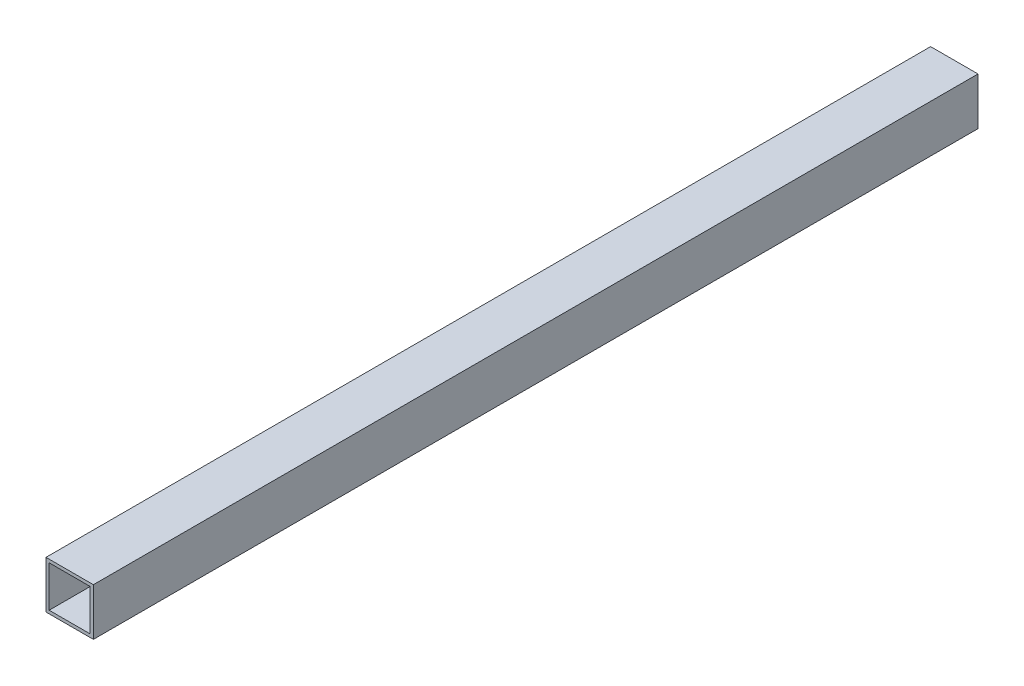
ISO-10303-21;
HEADER;
FILE_DESCRIPTION(('STEP AP214'),'2;1');
FILE_NAME('part.step','',(''),(''),'','','');
FILE_SCHEMA(('AUTOMOTIVE_DESIGN { 1 0 10303 214 1 1 1 1 }'));
ENDSEC;
DATA;
#1=APPLICATION_CONTEXT('core data for automotive mechanical design processes');
#2=APPLICATION_PROTOCOL_DEFINITION('international standard','automotive_design',2000,#1);
#3=PRODUCT_CONTEXT('',#1,'mechanical');
#4=PRODUCT('Part','Part','',(#3));
#5=PRODUCT_RELATED_PRODUCT_CATEGORY('part','',(#4));
#6=PRODUCT_DEFINITION_FORMATION('','',#4);
#7=PRODUCT_DEFINITION_CONTEXT('part definition',#1,'design');
#8=PRODUCT_DEFINITION('design','',#6,#7);
#9=PRODUCT_DEFINITION_SHAPE('','',#8);
#10=(LENGTH_UNIT() NAMED_UNIT(*) SI_UNIT(.MILLI.,.METRE.));
#11=(NAMED_UNIT(*) PLANE_ANGLE_UNIT() SI_UNIT($,.RADIAN.));
#12=(NAMED_UNIT(*) SI_UNIT($,.STERADIAN.) SOLID_ANGLE_UNIT());
#13=UNCERTAINTY_MEASURE_WITH_UNIT(LENGTH_MEASURE(1.E-05),#10,'distance_accuracy_value','');
#14=(GEOMETRIC_REPRESENTATION_CONTEXT(3) GLOBAL_UNCERTAINTY_ASSIGNED_CONTEXT((#13)) GLOBAL_UNIT_ASSIGNED_CONTEXT((#10,
#11,#12)) REPRESENTATION_CONTEXT('',''));
#15=CARTESIAN_POINT('',(0.,0.,0.));
#16=DIRECTION('',(0.,0.,1.));
#17=DIRECTION('',(1.,0.,0.));
#18=AXIS2_PLACEMENT_3D('',#15,#16,#17);
#19=CARTESIAN_POINT('',(0.,0.,280.));
#20=DIRECTION('',(0.,0.,1.));
#21=DIRECTION('',(1.,0.,0.));
#22=AXIS2_PLACEMENT_3D('',#19,#20,#21);
#23=PLANE('',#22);
#24=DIRECTION('',(0.,-1.,0.));
#25=VECTOR('',#24,1.);
#26=CARTESIAN_POINT('',(-7.5,7.5,280.));
#27=LINE('',#26,#25);
#28=CARTESIAN_POINT('',(-7.5,7.5,280.));
#29=VERTEX_POINT('',#28);
#30=CARTESIAN_POINT('',(-7.5,-7.5,280.));
#31=VERTEX_POINT('',#30);
#32=EDGE_CURVE('E133',#29,#31,#27,.T.);
#33=ORIENTED_EDGE('',*,*,#32,.T.);
#34=DIRECTION('',(1.,0.,0.));
#35=VECTOR('',#34,1.);
#36=CARTESIAN_POINT('',(-7.5,-7.5,280.));
#37=LINE('',#36,#35);
#38=CARTESIAN_POINT('',(7.5,-7.5,280.));
#39=VERTEX_POINT('',#38);
#40=EDGE_CURVE('E136',#31,#39,#37,.T.);
#41=ORIENTED_EDGE('',*,*,#40,.T.);
#42=DIRECTION('',(0.,1.,0.));
#43=VECTOR('',#42,1.);
#44=CARTESIAN_POINT('',(7.5,7.5,280.));
#45=LINE('',#44,#43);
#46=CARTESIAN_POINT('',(7.5,7.5,280.));
#47=VERTEX_POINT('',#46);
#48=EDGE_CURVE('E139',#39,#47,#45,.T.);
#49=ORIENTED_EDGE('',*,*,#48,.T.);
#50=DIRECTION('',(-1.,0.,0.));
#51=VECTOR('',#50,1.);
#52=CARTESIAN_POINT('',(-7.5,7.5,280.));
#53=LINE('',#52,#51);
#54=EDGE_CURVE('E141',#47,#29,#53,.T.);
#55=ORIENTED_EDGE('',*,*,#54,.T.);
#56=EDGE_LOOP('',(#33,#41,#49,#55));
#57=FACE_BOUND('',#56,.T.);
#58=DIRECTION('',(-1.,0.,0.));
#59=VECTOR('',#58,1.);
#60=CARTESIAN_POINT('',(-6.5,6.5,280.));
#61=LINE('',#60,#59);
#62=CARTESIAN_POINT('',(6.5,6.5,280.));
#63=VERTEX_POINT('',#62);
#64=CARTESIAN_POINT('',(-6.5,6.5,280.));
#65=VERTEX_POINT('',#64);
#66=EDGE_CURVE('E105',#63,#65,#61,.T.);
#67=ORIENTED_EDGE('',*,*,#66,.F.);
#68=DIRECTION('',(0.,1.,0.));
#69=VECTOR('',#68,1.);
#70=CARTESIAN_POINT('',(6.5,6.5,280.));
#71=LINE('',#70,#69);
#72=CARTESIAN_POINT('',(6.5,-6.5,280.));
#73=VERTEX_POINT('',#72);
#74=EDGE_CURVE('E97',#73,#63,#71,.T.);
#75=ORIENTED_EDGE('',*,*,#74,.F.);
#76=DIRECTION('',(1.,0.,0.));
#77=VECTOR('',#76,1.);
#78=CARTESIAN_POINT('',(-6.5,-6.5,280.));
#79=LINE('',#78,#77);
#80=CARTESIAN_POINT('',(-6.5,-6.5,280.));
#81=VERTEX_POINT('',#80);
#82=EDGE_CURVE('E119',#81,#73,#79,.T.);
#83=ORIENTED_EDGE('',*,*,#82,.F.);
#84=DIRECTION('',(0.,-1.,0.));
#85=VECTOR('',#84,1.);
#86=CARTESIAN_POINT('',(-6.5,6.5,280.));
#87=LINE('',#86,#85);
#88=EDGE_CURVE('E117',#65,#81,#87,.T.);
#89=ORIENTED_EDGE('',*,*,#88,.F.);
#90=EDGE_LOOP('',(#67,#75,#83,#89));
#91=FACE_BOUND('',#90,.T.);
#92=ADVANCED_FACE('F32',(#57,#91),#23,.T.);
#93=CARTESIAN_POINT('',(0.,0.,0.));
#94=DIRECTION('',(0.,0.,1.));
#95=DIRECTION('',(1.,0.,0.));
#96=AXIS2_PLACEMENT_3D('',#93,#94,#95);
#97=PLANE('',#96);
#98=DIRECTION('',(0.,-1.,0.));
#99=VECTOR('',#98,1.);
#100=CARTESIAN_POINT('',(-7.5,7.5,0.));
#101=LINE('',#100,#99);
#102=CARTESIAN_POINT('',(-7.5,7.5,0.));
#103=VERTEX_POINT('',#102);
#104=CARTESIAN_POINT('',(-7.5,-7.5,0.));
#105=VERTEX_POINT('',#104);
#106=EDGE_CURVE('E113',#103,#105,#101,.T.);
#107=ORIENTED_EDGE('',*,*,#106,.F.);
#108=DIRECTION('',(-1.,0.,0.));
#109=VECTOR('',#108,1.);
#110=CARTESIAN_POINT('',(-7.5,7.5,0.));
#111=LINE('',#110,#109);
#112=CARTESIAN_POINT('',(7.5,7.5,0.));
#113=VERTEX_POINT('',#112);
#114=EDGE_CURVE('E137',#113,#103,#111,.T.);
#115=ORIENTED_EDGE('',*,*,#114,.F.);
#116=DIRECTION('',(0.,1.,0.));
#117=VECTOR('',#116,1.);
#118=CARTESIAN_POINT('',(7.5,7.5,0.));
#119=LINE('',#118,#117);
#120=CARTESIAN_POINT('',(7.5,-7.5,0.));
#121=VERTEX_POINT('',#120);
#122=EDGE_CURVE('E148',#121,#113,#119,.T.);
#123=ORIENTED_EDGE('',*,*,#122,.F.);
#124=DIRECTION('',(1.,0.,0.));
#125=VECTOR('',#124,1.);
#126=CARTESIAN_POINT('',(-7.5,-7.5,0.));
#127=LINE('',#126,#125);
#128=EDGE_CURVE('E146',#105,#121,#127,.T.);
#129=ORIENTED_EDGE('',*,*,#128,.F.);
#130=EDGE_LOOP('',(#107,#115,#123,#129));
#131=FACE_BOUND('',#130,.T.);
#132=DIRECTION('',(0.,1.,0.));
#133=VECTOR('',#132,1.);
#134=CARTESIAN_POINT('',(6.5,6.5,0.));
#135=LINE('',#134,#133);
#136=CARTESIAN_POINT('',(6.5,-6.5,0.));
#137=VERTEX_POINT('',#136);
#138=CARTESIAN_POINT('',(6.5,6.5,0.));
#139=VERTEX_POINT('',#138);
#140=EDGE_CURVE('E55',#137,#139,#135,.T.);
#141=ORIENTED_EDGE('',*,*,#140,.T.);
#142=DIRECTION('',(-1.,0.,0.));
#143=VECTOR('',#142,1.);
#144=CARTESIAN_POINT('',(-6.5,6.5,0.));
#145=LINE('',#144,#143);
#146=CARTESIAN_POINT('',(-6.5,6.5,0.));
#147=VERTEX_POINT('',#146);
#148=EDGE_CURVE('E112',#139,#147,#145,.T.);
#149=ORIENTED_EDGE('',*,*,#148,.T.);
#150=DIRECTION('',(0.,-1.,0.));
#151=VECTOR('',#150,1.);
#152=CARTESIAN_POINT('',(-6.5,6.5,0.));
#153=LINE('',#152,#151);
#154=CARTESIAN_POINT('',(-6.5,-6.5,0.));
#155=VERTEX_POINT('',#154);
#156=EDGE_CURVE('E125',#147,#155,#153,.T.);
#157=ORIENTED_EDGE('',*,*,#156,.T.);
#158=DIRECTION('',(1.,0.,0.));
#159=VECTOR('',#158,1.);
#160=CARTESIAN_POINT('',(-6.5,-6.5,0.));
#161=LINE('',#160,#159);
#162=EDGE_CURVE('E106',#155,#137,#161,.T.);
#163=ORIENTED_EDGE('',*,*,#162,.T.);
#164=EDGE_LOOP('',(#141,#149,#157,#163));
#165=FACE_BOUND('',#164,.T.);
#166=ADVANCED_FACE('F166',(#131,#165),#97,.F.);
#167=CARTESIAN_POINT('',(-7.5,7.5,280.));
#168=DIRECTION('',(1.,0.,0.));
#169=DIRECTION('',(0.,1.,0.));
#170=AXIS2_PLACEMENT_3D('',#167,#168,#169);
#171=PLANE('',#170);
#172=ORIENTED_EDGE('',*,*,#106,.T.);
#173=DIRECTION('',(0.,0.,-1.));
#174=VECTOR('',#173,1.);
#175=CARTESIAN_POINT('',(-7.5,-7.5,280.));
#176=LINE('',#175,#174);
#177=EDGE_CURVE('E11',#31,#105,#176,.T.);
#178=ORIENTED_EDGE('',*,*,#177,.F.);
#179=ORIENTED_EDGE('',*,*,#32,.F.);
#180=DIRECTION('',(0.,0.,-1.));
#181=VECTOR('',#180,1.);
#182=CARTESIAN_POINT('',(-7.5,7.5,280.));
#183=LINE('',#182,#181);
#184=EDGE_CURVE('E143',#29,#103,#183,.T.);
#185=ORIENTED_EDGE('',*,*,#184,.T.);
#186=EDGE_LOOP('',(#172,#178,#179,#185));
#187=FACE_BOUND('',#186,.T.);
#188=ADVANCED_FACE('F34',(#187),#171,.F.);
#189=CARTESIAN_POINT('',(-7.5,-7.5,280.));
#190=DIRECTION('',(0.,1.,0.));
#191=DIRECTION('',(0.,0.,1.));
#192=AXIS2_PLACEMENT_3D('',#189,#190,#191);
#193=PLANE('',#192);
#194=ORIENTED_EDGE('',*,*,#128,.T.);
#195=DIRECTION('',(0.,0.,-1.));
#196=VECTOR('',#195,1.);
#197=CARTESIAN_POINT('',(7.5,-7.5,280.));
#198=LINE('',#197,#196);
#199=EDGE_CURVE('E40',#39,#121,#198,.T.);
#200=ORIENTED_EDGE('',*,*,#199,.F.);
#201=ORIENTED_EDGE('',*,*,#40,.F.);
#202=ORIENTED_EDGE('',*,*,#177,.T.);
#203=EDGE_LOOP('',(#194,#200,#201,#202));
#204=FACE_BOUND('',#203,.T.);
#205=ADVANCED_FACE('F176',(#204),#193,.F.);
#206=CARTESIAN_POINT('',(7.5,7.5,280.));
#207=DIRECTION('',(-1.,0.,0.));
#208=DIRECTION('',(0.,-1.,0.));
#209=AXIS2_PLACEMENT_3D('',#206,#207,#208);
#210=PLANE('',#209);
#211=ORIENTED_EDGE('',*,*,#122,.T.);
#212=DIRECTION('',(0.,0.,-1.));
#213=VECTOR('',#212,1.);
#214=CARTESIAN_POINT('',(7.5,7.5,280.));
#215=LINE('',#214,#213);
#216=EDGE_CURVE('E153',#47,#113,#215,.T.);
#217=ORIENTED_EDGE('',*,*,#216,.F.);
#218=ORIENTED_EDGE('',*,*,#48,.F.);
#219=ORIENTED_EDGE('',*,*,#199,.T.);
#220=EDGE_LOOP('',(#211,#217,#218,#219));
#221=FACE_BOUND('',#220,.T.);
#222=ADVANCED_FACE('F160',(#221),#210,.F.);
#223=CARTESIAN_POINT('',(-7.5,7.5,280.));
#224=DIRECTION('',(0.,-1.,0.));
#225=DIRECTION('',(0.,0.,-1.));
#226=AXIS2_PLACEMENT_3D('',#223,#224,#225);
#227=PLANE('',#226);
#228=ORIENTED_EDGE('',*,*,#114,.T.);
#229=ORIENTED_EDGE('',*,*,#184,.F.);
#230=ORIENTED_EDGE('',*,*,#54,.F.);
#231=ORIENTED_EDGE('',*,*,#216,.T.);
#232=EDGE_LOOP('',(#228,#229,#230,#231));
#233=FACE_BOUND('',#232,.T.);
#234=ADVANCED_FACE('F170',(#233),#227,.F.);
#235=CARTESIAN_POINT('',(6.5,6.5,280.));
#236=DIRECTION('',(-1.,0.,0.));
#237=DIRECTION('',(0.,-1.,0.));
#238=AXIS2_PLACEMENT_3D('',#235,#236,#237);
#239=PLANE('',#238);
#240=ORIENTED_EDGE('',*,*,#140,.F.);
#241=DIRECTION('',(0.,0.,-1.));
#242=VECTOR('',#241,1.);
#243=CARTESIAN_POINT('',(6.5,-6.5,280.));
#244=LINE('',#243,#242);
#245=EDGE_CURVE('E101',#73,#137,#244,.T.);
#246=ORIENTED_EDGE('',*,*,#245,.F.);
#247=ORIENTED_EDGE('',*,*,#74,.T.);
#248=DIRECTION('',(0.,0.,-1.));
#249=VECTOR('',#248,1.);
#250=CARTESIAN_POINT('',(6.5,6.5,280.));
#251=LINE('',#250,#249);
#252=EDGE_CURVE('E100',#63,#139,#251,.T.);
#253=ORIENTED_EDGE('',*,*,#252,.T.);
#254=EDGE_LOOP('',(#240,#246,#247,#253));
#255=FACE_BOUND('',#254,.T.);
#256=ADVANCED_FACE('F99',(#255),#239,.T.);
#257=CARTESIAN_POINT('',(-6.5,6.5,280.));
#258=DIRECTION('',(0.,-1.,0.));
#259=DIRECTION('',(0.,0.,-1.));
#260=AXIS2_PLACEMENT_3D('',#257,#258,#259);
#261=PLANE('',#260);
#262=ORIENTED_EDGE('',*,*,#148,.F.);
#263=ORIENTED_EDGE('',*,*,#252,.F.);
#264=ORIENTED_EDGE('',*,*,#66,.T.);
#265=DIRECTION('',(0.,0.,-1.));
#266=VECTOR('',#265,1.);
#267=CARTESIAN_POINT('',(-6.5,6.5,280.));
#268=LINE('',#267,#266);
#269=EDGE_CURVE('E114',#65,#147,#268,.T.);
#270=ORIENTED_EDGE('',*,*,#269,.T.);
#271=EDGE_LOOP('',(#262,#263,#264,#270));
#272=FACE_BOUND('',#271,.T.);
#273=ADVANCED_FACE('F109',(#272),#261,.T.);
#274=CARTESIAN_POINT('',(-6.5,6.5,280.));
#275=DIRECTION('',(1.,0.,0.));
#276=DIRECTION('',(0.,1.,0.));
#277=AXIS2_PLACEMENT_3D('',#274,#275,#276);
#278=PLANE('',#277);
#279=ORIENTED_EDGE('',*,*,#156,.F.);
#280=ORIENTED_EDGE('',*,*,#269,.F.);
#281=ORIENTED_EDGE('',*,*,#88,.T.);
#282=DIRECTION('',(0.,0.,-1.));
#283=VECTOR('',#282,1.);
#284=CARTESIAN_POINT('',(-6.5,-6.5,280.));
#285=LINE('',#284,#283);
#286=EDGE_CURVE('E47',#81,#155,#285,.T.);
#287=ORIENTED_EDGE('',*,*,#286,.T.);
#288=EDGE_LOOP('',(#279,#280,#281,#287));
#289=FACE_BOUND('',#288,.T.);
#290=ADVANCED_FACE('F199',(#289),#278,.T.);
#291=CARTESIAN_POINT('',(-6.5,-6.5,280.));
#292=DIRECTION('',(0.,1.,0.));
#293=DIRECTION('',(0.,0.,1.));
#294=AXIS2_PLACEMENT_3D('',#291,#292,#293);
#295=PLANE('',#294);
#296=ORIENTED_EDGE('',*,*,#162,.F.);
#297=ORIENTED_EDGE('',*,*,#286,.F.);
#298=ORIENTED_EDGE('',*,*,#82,.T.);
#299=ORIENTED_EDGE('',*,*,#245,.T.);
#300=EDGE_LOOP('',(#296,#297,#298,#299));
#301=FACE_BOUND('',#300,.T.);
#302=ADVANCED_FACE('F203',(#301),#295,.T.);
#303=CLOSED_SHELL('',(#92,#166,#188,#205,#222,#234,#256,#273,#290,#302));
#304=MANIFOLD_SOLID_BREP('B2',#303);
#305=ADVANCED_BREP_SHAPE_REPRESENTATION('',(#18,#304),#14);
#306=SHAPE_DEFINITION_REPRESENTATION(#9,#305);
ENDSEC;
END-ISO-10303-21;
